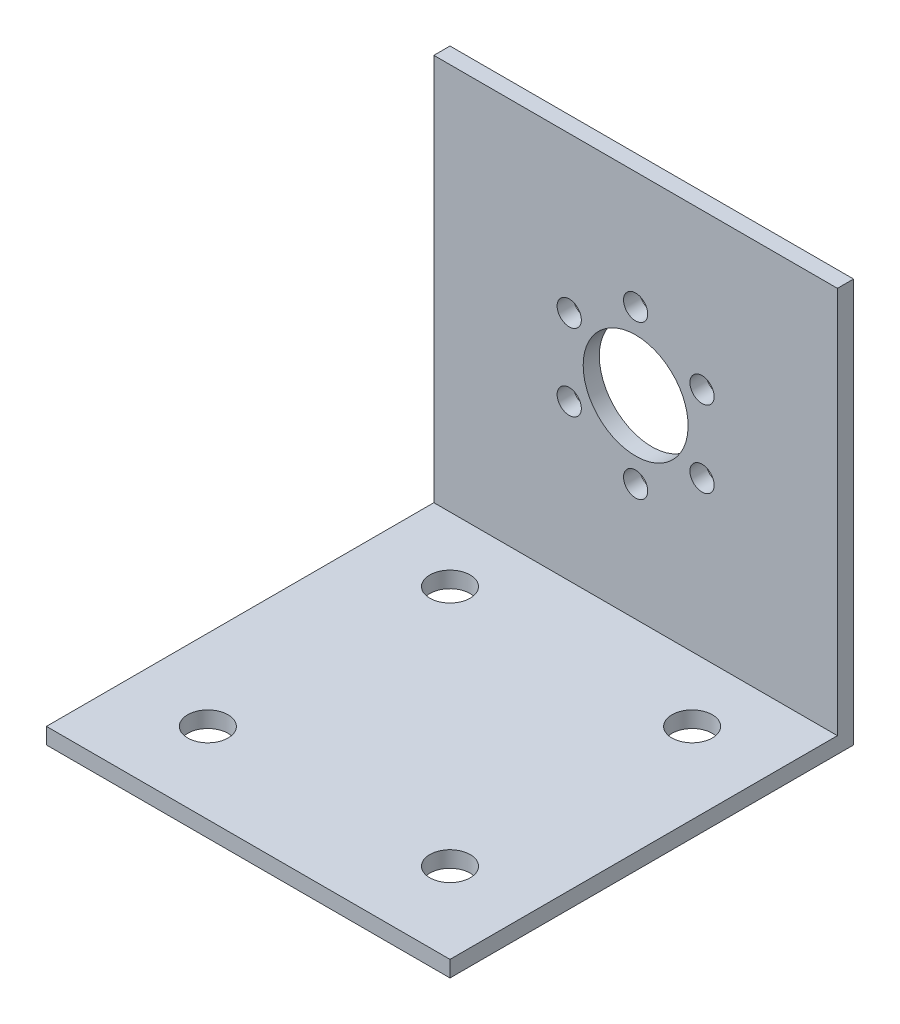
ISO-10303-21;
HEADER;
FILE_DESCRIPTION(('STEP AP214'),'2;1');
FILE_NAME('part.step','',(''),(''),'','','');
FILE_SCHEMA(('AUTOMOTIVE_DESIGN { 1 0 10303 214 1 1 1 1 }'));
ENDSEC;
DATA;
#1=APPLICATION_CONTEXT('core data for automotive mechanical design processes');
#2=APPLICATION_PROTOCOL_DEFINITION('international standard','automotive_design',2000,#1);
#3=PRODUCT_CONTEXT('',#1,'mechanical');
#4=PRODUCT('Part','Part','',(#3));
#5=PRODUCT_RELATED_PRODUCT_CATEGORY('part','',(#4));
#6=PRODUCT_DEFINITION_FORMATION('','',#4);
#7=PRODUCT_DEFINITION_CONTEXT('part definition',#1,'design');
#8=PRODUCT_DEFINITION('design','',#6,#7);
#9=PRODUCT_DEFINITION_SHAPE('','',#8);
#10=(LENGTH_UNIT() NAMED_UNIT(*) SI_UNIT(.MILLI.,.METRE.));
#11=(NAMED_UNIT(*) PLANE_ANGLE_UNIT() SI_UNIT($,.RADIAN.));
#12=(NAMED_UNIT(*) SI_UNIT($,.STERADIAN.) SOLID_ANGLE_UNIT());
#13=UNCERTAINTY_MEASURE_WITH_UNIT(LENGTH_MEASURE(1.E-05),#10,'distance_accuracy_value','');
#14=(GEOMETRIC_REPRESENTATION_CONTEXT(3) GLOBAL_UNCERTAINTY_ASSIGNED_CONTEXT((#13)) GLOBAL_UNIT_ASSIGNED_CONTEXT((#10,
#11,#12)) REPRESENTATION_CONTEXT('',''));
#15=CARTESIAN_POINT('',(0.,0.,0.));
#16=DIRECTION('',(0.,0.,1.));
#17=DIRECTION('',(1.,0.,0.));
#18=AXIS2_PLACEMENT_3D('',#15,#16,#17);
#19=CARTESIAN_POINT('',(50.,2.,0.));
#20=DIRECTION('',(0.,0.,-1.));
#21=DIRECTION('',(0.,1.,0.));
#22=AXIS2_PLACEMENT_3D('',#19,#20,#21);
#23=PLANE('',#22);
#24=DIRECTION('',(0.,-1.,0.));
#25=VECTOR('',#24,1.);
#26=CARTESIAN_POINT('',(0.,2.,0.));
#27=LINE('',#26,#25);
#28=CARTESIAN_POINT('',(0.,2.,0.));
#29=VERTEX_POINT('',#28);
#30=CARTESIAN_POINT('',(0.,0.,0.));
#31=VERTEX_POINT('',#30);
#32=EDGE_CURVE('E121',#29,#31,#27,.T.);
#33=ORIENTED_EDGE('',*,*,#32,.T.);
#34=DIRECTION('',(-1.,0.,0.));
#35=VECTOR('',#34,1.);
#36=CARTESIAN_POINT('',(50.,0.,0.));
#37=LINE('',#36,#35);
#38=CARTESIAN_POINT('',(50.,0.,0.));
#39=VERTEX_POINT('',#38);
#40=EDGE_CURVE('E11',#39,#31,#37,.T.);
#41=ORIENTED_EDGE('',*,*,#40,.F.);
#42=DIRECTION('',(0.,-1.,0.));
#43=VECTOR('',#42,1.);
#44=CARTESIAN_POINT('',(50.,2.,0.));
#45=LINE('',#44,#43);
#46=CARTESIAN_POINT('',(50.,2.,0.));
#47=VERTEX_POINT('',#46);
#48=EDGE_CURVE('E132',#47,#39,#45,.T.);
#49=ORIENTED_EDGE('',*,*,#48,.F.);
#50=DIRECTION('',(-1.,0.,0.));
#51=VECTOR('',#50,1.);
#52=CARTESIAN_POINT('',(50.,2.,0.));
#53=LINE('',#52,#51);
#54=EDGE_CURVE('E117',#47,#29,#53,.T.);
#55=ORIENTED_EDGE('',*,*,#54,.T.);
#56=EDGE_LOOP('',(#33,#41,#49,#55));
#57=FACE_BOUND('',#56,.T.);
#58=ADVANCED_FACE('F35',(#57),#23,.F.);
#59=CARTESIAN_POINT('',(50.,0.,0.));
#60=DIRECTION('',(0.,1.,0.));
#61=DIRECTION('',(0.,0.,1.));
#62=AXIS2_PLACEMENT_3D('',#59,#60,#61);
#63=PLANE('',#62);
#64=CARTESIAN_POINT('',(40.,0.,-10.));
#65=DIRECTION('',(0.,-1.,0.));
#66=DIRECTION('',(0.,0.,-1.));
#67=AXIS2_PLACEMENT_3D('',#64,#65,#66);
#68=CIRCLE('',#67,2.5);
#69=CARTESIAN_POINT('',(40.,0.,-12.5));
#70=VERTEX_POINT('',#69);
#71=EDGE_CURVE('E369',#70,#70,#68,.T.);
#72=ORIENTED_EDGE('',*,*,#71,.F.);
#73=EDGE_LOOP('',(#72));
#74=FACE_BOUND('',#73,.T.);
#75=CARTESIAN_POINT('',(10.,0.,-40.));
#76=DIRECTION('',(0.,-1.,0.));
#77=DIRECTION('',(0.,0.,-1.));
#78=AXIS2_PLACEMENT_3D('',#75,#76,#77);
#79=CIRCLE('',#78,2.5);
#80=CARTESIAN_POINT('',(10.,0.,-42.5));
#81=VERTEX_POINT('',#80);
#82=EDGE_CURVE('E370',#81,#81,#79,.T.);
#83=ORIENTED_EDGE('',*,*,#82,.F.);
#84=EDGE_LOOP('',(#83));
#85=FACE_BOUND('',#84,.T.);
#86=CARTESIAN_POINT('',(40.,0.,-40.));
#87=DIRECTION('',(0.,-1.,0.));
#88=DIRECTION('',(0.,0.,-1.));
#89=AXIS2_PLACEMENT_3D('',#86,#87,#88);
#90=CIRCLE('',#89,2.5);
#91=CARTESIAN_POINT('',(40.,0.,-42.5));
#92=VERTEX_POINT('',#91);
#93=EDGE_CURVE('E375',#92,#92,#90,.T.);
#94=ORIENTED_EDGE('',*,*,#93,.F.);
#95=EDGE_LOOP('',(#94));
#96=FACE_BOUND('',#95,.T.);
#97=CARTESIAN_POINT('',(10.,0.,-10.));
#98=DIRECTION('',(0.,-1.,0.));
#99=DIRECTION('',(0.,0.,-1.));
#100=AXIS2_PLACEMENT_3D('',#97,#98,#99);
#101=CIRCLE('',#100,2.5);
#102=CARTESIAN_POINT('',(10.,0.,-12.5));
#103=VERTEX_POINT('',#102);
#104=EDGE_CURVE('E163',#103,#103,#101,.T.);
#105=ORIENTED_EDGE('',*,*,#104,.F.);
#106=EDGE_LOOP('',(#105));
#107=FACE_BOUND('',#106,.T.);
#108=DIRECTION('',(0.,0.,-1.));
#109=VECTOR('',#108,1.);
#110=CARTESIAN_POINT('',(0.,0.,0.));
#111=LINE('',#110,#109);
#112=CARTESIAN_POINT('',(0.,0.,-50.));
#113=VERTEX_POINT('',#112);
#114=EDGE_CURVE('E124',#31,#113,#111,.T.);
#115=ORIENTED_EDGE('',*,*,#114,.T.);
#116=DIRECTION('',(-1.,0.,0.));
#117=VECTOR('',#116,1.);
#118=CARTESIAN_POINT('',(50.,0.,-50.));
#119=LINE('',#118,#117);
#120=CARTESIAN_POINT('',(50.,0.,-50.));
#121=VERTEX_POINT('',#120);
#122=EDGE_CURVE('E44',#121,#113,#119,.T.);
#123=ORIENTED_EDGE('',*,*,#122,.F.);
#124=DIRECTION('',(0.,0.,-1.));
#125=VECTOR('',#124,1.);
#126=CARTESIAN_POINT('',(50.,0.,0.));
#127=LINE('',#126,#125);
#128=EDGE_CURVE('E90',#39,#121,#127,.T.);
#129=ORIENTED_EDGE('',*,*,#128,.F.);
#130=ORIENTED_EDGE('',*,*,#40,.T.);
#131=EDGE_LOOP('',(#115,#123,#129,#130));
#132=FACE_BOUND('',#131,.T.);
#133=ADVANCED_FACE('F189',(#74,#85,#96,#107,#132),#63,.F.);
#134=CARTESIAN_POINT('',(50.,0.,-50.));
#135=DIRECTION('',(0.,0.,1.));
#136=DIRECTION('',(1.,0.,0.));
#137=AXIS2_PLACEMENT_3D('',#134,#135,#136);
#138=PLANE('',#137);
#139=CARTESIAN_POINT('',(33.227241335952,30.7499999999996,-50.));
#140=DIRECTION('',(0.,0.,-1.));
#141=DIRECTION('',(-1.,0.,0.));
#142=AXIS2_PLACEMENT_3D('',#139,#140,#141);
#143=CIRCLE('',#142,1.50000000000014);
#144=CARTESIAN_POINT('',(31.7272413359518,30.7499999999996,-50.));
#145=VERTEX_POINT('',#144);
#146=EDGE_CURVE('E170',#145,#145,#143,.T.);
#147=ORIENTED_EDGE('',*,*,#146,.F.);
#148=EDGE_LOOP('',(#147));
#149=FACE_BOUND('',#148,.T.);
#150=CARTESIAN_POINT('',(33.2272413359516,21.2499999999997,-50.));
#151=DIRECTION('',(0.,0.,-1.));
#152=DIRECTION('',(-1.,0.,0.));
#153=AXIS2_PLACEMENT_3D('',#150,#151,#152);
#154=CIRCLE('',#153,1.5);
#155=CARTESIAN_POINT('',(31.7272413359516,21.2499999999997,-50.));
#156=VERTEX_POINT('',#155);
#157=EDGE_CURVE('E174',#156,#156,#154,.T.);
#158=ORIENTED_EDGE('',*,*,#157,.F.);
#159=EDGE_LOOP('',(#158));
#160=FACE_BOUND('',#159,.T.);
#161=CARTESIAN_POINT('',(24.9999999999993,16.5,-50.));
#162=DIRECTION('',(0.,0.,-1.));
#163=DIRECTION('',(-1.,0.,0.));
#164=AXIS2_PLACEMENT_3D('',#161,#162,#163);
#165=CIRCLE('',#164,1.5);
#166=CARTESIAN_POINT('',(23.4999999999993,16.5,-50.));
#167=VERTEX_POINT('',#166);
#168=EDGE_CURVE('E179',#167,#167,#165,.T.);
#169=ORIENTED_EDGE('',*,*,#168,.F.);
#170=EDGE_LOOP('',(#169));
#171=FACE_BOUND('',#170,.T.);
#172=CARTESIAN_POINT('',(16.7727586640473,21.2500000000003,-50.));
#173=DIRECTION('',(0.,0.,-1.));
#174=DIRECTION('',(-1.,0.,0.));
#175=AXIS2_PLACEMENT_3D('',#172,#173,#174);
#176=CIRCLE('',#175,1.5);
#177=CARTESIAN_POINT('',(15.2727586640473,21.2500000000003,-50.));
#178=VERTEX_POINT('',#177);
#179=EDGE_CURVE('E384',#178,#178,#176,.T.);
#180=ORIENTED_EDGE('',*,*,#179,.F.);
#181=EDGE_LOOP('',(#180));
#182=FACE_BOUND('',#181,.T.);
#183=CARTESIAN_POINT('',(16.7727586640476,30.7500000000003,-50.));
#184=DIRECTION('',(0.,0.,-1.));
#185=DIRECTION('',(-1.,0.,0.));
#186=AXIS2_PLACEMENT_3D('',#183,#184,#185);
#187=CIRCLE('',#186,1.5);
#188=CARTESIAN_POINT('',(15.2727586640476,30.7500000000003,-50.));
#189=VERTEX_POINT('',#188);
#190=EDGE_CURVE('E381',#189,#189,#187,.T.);
#191=ORIENTED_EDGE('',*,*,#190,.F.);
#192=EDGE_LOOP('',(#191));
#193=FACE_BOUND('',#192,.T.);
#194=CARTESIAN_POINT('',(25.,35.5,-50.));
#195=DIRECTION('',(0.,0.,-1.));
#196=DIRECTION('',(-1.,0.,0.));
#197=AXIS2_PLACEMENT_3D('',#194,#195,#196);
#198=CIRCLE('',#197,1.5);
#199=CARTESIAN_POINT('',(23.5,35.5,-50.));
#200=VERTEX_POINT('',#199);
#201=EDGE_CURVE('E185',#200,#200,#198,.T.);
#202=ORIENTED_EDGE('',*,*,#201,.F.);
#203=EDGE_LOOP('',(#202));
#204=FACE_BOUND('',#203,.T.);
#205=CARTESIAN_POINT('',(25.,26.,-50.));
#206=DIRECTION('',(0.,0.,-1.));
#207=DIRECTION('',(-1.,0.,0.));
#208=AXIS2_PLACEMENT_3D('',#205,#206,#207);
#209=CIRCLE('',#208,6.5);
#210=CARTESIAN_POINT('',(18.5,26.,-50.));
#211=VERTEX_POINT('',#210);
#212=EDGE_CURVE('E142',#211,#211,#209,.T.);
#213=ORIENTED_EDGE('',*,*,#212,.F.);
#214=EDGE_LOOP('',(#213));
#215=FACE_BOUND('',#214,.T.);
#216=DIRECTION('',(0.,1.,0.));
#217=VECTOR('',#216,1.);
#218=CARTESIAN_POINT('',(0.,0.,-50.));
#219=LINE('',#218,#217);
#220=CARTESIAN_POINT('',(0.,50.,-50.));
#221=VERTEX_POINT('',#220);
#222=EDGE_CURVE('E127',#113,#221,#219,.T.);
#223=ORIENTED_EDGE('',*,*,#222,.T.);
#224=DIRECTION('',(-1.,0.,0.));
#225=VECTOR('',#224,1.);
#226=CARTESIAN_POINT('',(50.,50.,-50.));
#227=LINE('',#226,#225);
#228=CARTESIAN_POINT('',(50.,50.,-50.));
#229=VERTEX_POINT('',#228);
#230=EDGE_CURVE('E112',#229,#221,#227,.T.);
#231=ORIENTED_EDGE('',*,*,#230,.F.);
#232=DIRECTION('',(0.,1.,0.));
#233=VECTOR('',#232,1.);
#234=CARTESIAN_POINT('',(50.,0.,-50.));
#235=LINE('',#234,#233);
#236=EDGE_CURVE('E103',#121,#229,#235,.T.);
#237=ORIENTED_EDGE('',*,*,#236,.F.);
#238=ORIENTED_EDGE('',*,*,#122,.T.);
#239=EDGE_LOOP('',(#223,#231,#237,#238));
#240=FACE_BOUND('',#239,.T.);
#241=ADVANCED_FACE('F192',(#149,#160,#171,#182,#193,#204,#215,#240),#138,.F.);
#242=CARTESIAN_POINT('',(50.,50.,-50.));
#243=DIRECTION('',(0.,-1.,0.));
#244=DIRECTION('',(0.,0.,-1.));
#245=AXIS2_PLACEMENT_3D('',#242,#243,#244);
#246=PLANE('',#245);
#247=DIRECTION('',(0.,0.,1.));
#248=VECTOR('',#247,1.);
#249=CARTESIAN_POINT('',(0.,50.,-50.));
#250=LINE('',#249,#248);
#251=CARTESIAN_POINT('',(0.,50.,-48.));
#252=VERTEX_POINT('',#251);
#253=EDGE_CURVE('E111',#221,#252,#250,.T.);
#254=ORIENTED_EDGE('',*,*,#253,.T.);
#255=DIRECTION('',(-1.,0.,0.));
#256=VECTOR('',#255,1.);
#257=CARTESIAN_POINT('',(50.,50.,-48.));
#258=LINE('',#257,#256);
#259=CARTESIAN_POINT('',(50.,50.,-48.));
#260=VERTEX_POINT('',#259);
#261=EDGE_CURVE('E108',#260,#252,#258,.T.);
#262=ORIENTED_EDGE('',*,*,#261,.F.);
#263=DIRECTION('',(0.,0.,1.));
#264=VECTOR('',#263,1.);
#265=CARTESIAN_POINT('',(50.,50.,-50.));
#266=LINE('',#265,#264);
#267=EDGE_CURVE('E97',#229,#260,#266,.T.);
#268=ORIENTED_EDGE('',*,*,#267,.F.);
#269=ORIENTED_EDGE('',*,*,#230,.T.);
#270=EDGE_LOOP('',(#254,#262,#268,#269));
#271=FACE_BOUND('',#270,.T.);
#272=ADVANCED_FACE('F109',(#271),#246,.F.);
#273=CARTESIAN_POINT('',(50.,50.,-48.));
#274=DIRECTION('',(0.,0.,-1.));
#275=DIRECTION('',(0.,1.,0.));
#276=AXIS2_PLACEMENT_3D('',#273,#274,#275);
#277=PLANE('',#276);
#278=CARTESIAN_POINT('',(33.227241335952,30.7499999999996,-48.));
#279=DIRECTION('',(0.,0.,-1.));
#280=DIRECTION('',(0.,1.,0.));
#281=AXIS2_PLACEMENT_3D('',#278,#279,#280);
#282=CIRCLE('',#281,1.50000000000014);
#283=CARTESIAN_POINT('',(33.227241335952,32.2499999999998,-48.));
#284=VERTEX_POINT('',#283);
#285=EDGE_CURVE('E125',#284,#284,#282,.T.);
#286=ORIENTED_EDGE('',*,*,#285,.T.);
#287=EDGE_LOOP('',(#286));
#288=FACE_BOUND('',#287,.T.);
#289=CARTESIAN_POINT('',(33.2272413359516,21.2499999999997,-48.));
#290=DIRECTION('',(0.,0.,-1.));
#291=DIRECTION('',(0.,1.,0.));
#292=AXIS2_PLACEMENT_3D('',#289,#290,#291);
#293=CIRCLE('',#292,1.5);
#294=CARTESIAN_POINT('',(33.2272413359516,22.7499999999997,-48.));
#295=VERTEX_POINT('',#294);
#296=EDGE_CURVE('E154',#295,#295,#293,.T.);
#297=ORIENTED_EDGE('',*,*,#296,.T.);
#298=EDGE_LOOP('',(#297));
#299=FACE_BOUND('',#298,.T.);
#300=CARTESIAN_POINT('',(24.9999999999993,16.5,-48.));
#301=DIRECTION('',(0.,0.,-1.));
#302=DIRECTION('',(0.,1.,0.));
#303=AXIS2_PLACEMENT_3D('',#300,#301,#302);
#304=CIRCLE('',#303,1.5);
#305=CARTESIAN_POINT('',(24.9999999999993,18.,-48.));
#306=VERTEX_POINT('',#305);
#307=EDGE_CURVE('E151',#306,#306,#304,.T.);
#308=ORIENTED_EDGE('',*,*,#307,.T.);
#309=EDGE_LOOP('',(#308));
#310=FACE_BOUND('',#309,.T.);
#311=CARTESIAN_POINT('',(16.7727586640473,21.2500000000003,-48.));
#312=DIRECTION('',(0.,0.,-1.));
#313=DIRECTION('',(0.,1.,0.));
#314=AXIS2_PLACEMENT_3D('',#311,#312,#313);
#315=CIRCLE('',#314,1.5);
#316=CARTESIAN_POINT('',(16.7727586640473,22.7500000000003,-48.));
#317=VERTEX_POINT('',#316);
#318=EDGE_CURVE('E148',#317,#317,#315,.T.);
#319=ORIENTED_EDGE('',*,*,#318,.T.);
#320=EDGE_LOOP('',(#319));
#321=FACE_BOUND('',#320,.T.);
#322=CARTESIAN_POINT('',(16.7727586640476,30.7500000000003,-48.));
#323=DIRECTION('',(0.,0.,-1.));
#324=DIRECTION('',(0.,1.,0.));
#325=AXIS2_PLACEMENT_3D('',#322,#323,#324);
#326=CIRCLE('',#325,1.5);
#327=CARTESIAN_POINT('',(16.7727586640476,32.2500000000003,-48.));
#328=VERTEX_POINT('',#327);
#329=EDGE_CURVE('E145',#328,#328,#326,.T.);
#330=ORIENTED_EDGE('',*,*,#329,.T.);
#331=EDGE_LOOP('',(#330));
#332=FACE_BOUND('',#331,.T.);
#333=CARTESIAN_POINT('',(25.,35.5,-48.));
#334=DIRECTION('',(0.,0.,-1.));
#335=DIRECTION('',(0.,1.,0.));
#336=AXIS2_PLACEMENT_3D('',#333,#334,#335);
#337=CIRCLE('',#336,1.5);
#338=CARTESIAN_POINT('',(25.,37.,-48.));
#339=VERTEX_POINT('',#338);
#340=EDGE_CURVE('E141',#339,#339,#337,.T.);
#341=ORIENTED_EDGE('',*,*,#340,.T.);
#342=EDGE_LOOP('',(#341));
#343=FACE_BOUND('',#342,.T.);
#344=CARTESIAN_POINT('',(25.,26.,-48.));
#345=DIRECTION('',(0.,0.,-1.));
#346=DIRECTION('',(0.,1.,0.));
#347=AXIS2_PLACEMENT_3D('',#344,#345,#346);
#348=CIRCLE('',#347,6.5);
#349=CARTESIAN_POINT('',(25.,32.5,-48.));
#350=VERTEX_POINT('',#349);
#351=EDGE_CURVE('E138',#350,#350,#348,.T.);
#352=ORIENTED_EDGE('',*,*,#351,.T.);
#353=EDGE_LOOP('',(#352));
#354=FACE_BOUND('',#353,.T.);
#355=DIRECTION('',(0.,-1.,0.));
#356=VECTOR('',#355,1.);
#357=CARTESIAN_POINT('',(0.,50.,-48.));
#358=LINE('',#357,#356);
#359=CARTESIAN_POINT('',(0.,2.00000000000001,-48.));
#360=VERTEX_POINT('',#359);
#361=EDGE_CURVE('E76',#252,#360,#358,.T.);
#362=ORIENTED_EDGE('',*,*,#361,.T.);
#363=DIRECTION('',(-1.,0.,0.));
#364=VECTOR('',#363,1.);
#365=CARTESIAN_POINT('',(50.,2.00000000000001,-48.));
#366=LINE('',#365,#364);
#367=CARTESIAN_POINT('',(50.,2.00000000000001,-48.));
#368=VERTEX_POINT('',#367);
#369=EDGE_CURVE('E113',#368,#360,#366,.T.);
#370=ORIENTED_EDGE('',*,*,#369,.F.);
#371=DIRECTION('',(0.,-1.,0.));
#372=VECTOR('',#371,1.);
#373=CARTESIAN_POINT('',(50.,50.,-48.));
#374=LINE('',#373,#372);
#375=EDGE_CURVE('E101',#260,#368,#374,.T.);
#376=ORIENTED_EDGE('',*,*,#375,.F.);
#377=ORIENTED_EDGE('',*,*,#261,.T.);
#378=EDGE_LOOP('',(#362,#370,#376,#377));
#379=FACE_BOUND('',#378,.T.);
#380=ADVANCED_FACE('F115',(#288,#299,#310,#321,#332,#343,#354,#379),#277,.F.);
#381=CARTESIAN_POINT('',(50.,2.00000000000001,-48.));
#382=DIRECTION('',(0.,-1.,0.));
#383=DIRECTION('',(0.,0.,-1.));
#384=AXIS2_PLACEMENT_3D('',#381,#382,#383);
#385=PLANE('',#384);
#386=CARTESIAN_POINT('',(40.,2.,-10.));
#387=DIRECTION('',(0.,-1.,0.));
#388=DIRECTION('',(0.,0.,-1.));
#389=AXIS2_PLACEMENT_3D('',#386,#387,#388);
#390=CIRCLE('',#389,2.5);
#391=CARTESIAN_POINT('',(40.,2.,-12.5));
#392=VERTEX_POINT('',#391);
#393=EDGE_CURVE('E38',#392,#392,#390,.T.);
#394=ORIENTED_EDGE('',*,*,#393,.T.);
#395=EDGE_LOOP('',(#394));
#396=FACE_BOUND('',#395,.T.);
#397=CARTESIAN_POINT('',(10.,2.00000000000001,-40.));
#398=DIRECTION('',(0.,-1.,0.));
#399=DIRECTION('',(0.,0.,-1.));
#400=AXIS2_PLACEMENT_3D('',#397,#398,#399);
#401=CIRCLE('',#400,2.5);
#402=CARTESIAN_POINT('',(10.,2.00000000000001,-42.5));
#403=VERTEX_POINT('',#402);
#404=EDGE_CURVE('E165',#403,#403,#401,.T.);
#405=ORIENTED_EDGE('',*,*,#404,.T.);
#406=EDGE_LOOP('',(#405));
#407=FACE_BOUND('',#406,.T.);
#408=CARTESIAN_POINT('',(40.,2.00000000000001,-40.));
#409=DIRECTION('',(0.,-1.,0.));
#410=DIRECTION('',(0.,0.,-1.));
#411=AXIS2_PLACEMENT_3D('',#408,#409,#410);
#412=CIRCLE('',#411,2.5);
#413=CARTESIAN_POINT('',(40.,2.00000000000001,-42.5));
#414=VERTEX_POINT('',#413);
#415=EDGE_CURVE('E162',#414,#414,#412,.T.);
#416=ORIENTED_EDGE('',*,*,#415,.T.);
#417=EDGE_LOOP('',(#416));
#418=FACE_BOUND('',#417,.T.);
#419=CARTESIAN_POINT('',(10.,2.,-10.));
#420=DIRECTION('',(0.,-1.,0.));
#421=DIRECTION('',(0.,0.,-1.));
#422=AXIS2_PLACEMENT_3D('',#419,#420,#421);
#423=CIRCLE('',#422,2.5);
#424=CARTESIAN_POINT('',(10.,2.,-12.5));
#425=VERTEX_POINT('',#424);
#426=EDGE_CURVE('E159',#425,#425,#423,.T.);
#427=ORIENTED_EDGE('',*,*,#426,.T.);
#428=EDGE_LOOP('',(#427));
#429=FACE_BOUND('',#428,.T.);
#430=DIRECTION('',(0.,0.,1.));
#431=VECTOR('',#430,1.);
#432=CARTESIAN_POINT('',(0.,2.00000000000001,-48.));
#433=LINE('',#432,#431);
#434=EDGE_CURVE('E82',#360,#29,#433,.T.);
#435=ORIENTED_EDGE('',*,*,#434,.T.);
#436=ORIENTED_EDGE('',*,*,#54,.F.);
#437=DIRECTION('',(0.,0.,1.));
#438=VECTOR('',#437,1.);
#439=CARTESIAN_POINT('',(50.,2.00000000000001,-48.));
#440=LINE('',#439,#438);
#441=EDGE_CURVE('E53',#368,#47,#440,.T.);
#442=ORIENTED_EDGE('',*,*,#441,.F.);
#443=ORIENTED_EDGE('',*,*,#369,.T.);
#444=EDGE_LOOP('',(#435,#436,#442,#443));
#445=FACE_BOUND('',#444,.T.);
#446=ADVANCED_FACE('F197',(#396,#407,#418,#429,#445),#385,.F.);
#447=CARTESIAN_POINT('',(50.,0.,0.));
#448=DIRECTION('',(1.,0.,0.));
#449=DIRECTION('',(0.,0.,-1.));
#450=AXIS2_PLACEMENT_3D('',#447,#448,#449);
#451=PLANE('',#450);
#452=ORIENTED_EDGE('',*,*,#48,.T.);
#453=ORIENTED_EDGE('',*,*,#128,.T.);
#454=ORIENTED_EDGE('',*,*,#236,.T.);
#455=ORIENTED_EDGE('',*,*,#267,.T.);
#456=ORIENTED_EDGE('',*,*,#375,.T.);
#457=ORIENTED_EDGE('',*,*,#441,.T.);
#458=EDGE_LOOP('',(#452,#453,#454,#455,#456,#457));
#459=FACE_BOUND('',#458,.T.);
#460=ADVANCED_FACE('F99',(#459),#451,.T.);
#461=CARTESIAN_POINT('',(0.,0.,0.));
#462=DIRECTION('',(1.,0.,0.));
#463=DIRECTION('',(0.,0.,-1.));
#464=AXIS2_PLACEMENT_3D('',#461,#462,#463);
#465=PLANE('',#464);
#466=ORIENTED_EDGE('',*,*,#32,.F.);
#467=ORIENTED_EDGE('',*,*,#434,.F.);
#468=ORIENTED_EDGE('',*,*,#361,.F.);
#469=ORIENTED_EDGE('',*,*,#253,.F.);
#470=ORIENTED_EDGE('',*,*,#222,.F.);
#471=ORIENTED_EDGE('',*,*,#114,.F.);
#472=EDGE_LOOP('',(#466,#467,#468,#469,#470,#471));
#473=FACE_BOUND('',#472,.T.);
#474=ADVANCED_FACE('F195',(#473),#465,.F.);
#475=CARTESIAN_POINT('',(25.,26.,0.));
#476=DIRECTION('',(0.,0.,-1.));
#477=DIRECTION('',(-1.,0.,0.));
#478=AXIS2_PLACEMENT_3D('',#475,#476,#477);
#479=CYLINDRICAL_SURFACE('',#478,6.5);
#480=ORIENTED_EDGE('',*,*,#212,.T.);
#481=EDGE_LOOP('',(#480));
#482=FACE_BOUND('',#481,.T.);
#483=ORIENTED_EDGE('',*,*,#351,.F.);
#484=EDGE_LOOP('',(#483));
#485=FACE_BOUND('',#484,.T.);
#486=ADVANCED_FACE('F240',(#482,#485),#479,.F.);
#487=CARTESIAN_POINT('',(25.,35.5,0.));
#488=DIRECTION('',(0.,0.,-1.));
#489=DIRECTION('',(-1.,0.,0.));
#490=AXIS2_PLACEMENT_3D('',#487,#488,#489);
#491=CYLINDRICAL_SURFACE('',#490,1.5);
#492=ORIENTED_EDGE('',*,*,#201,.T.);
#493=EDGE_LOOP('',(#492));
#494=FACE_BOUND('',#493,.T.);
#495=ORIENTED_EDGE('',*,*,#340,.F.);
#496=EDGE_LOOP('',(#495));
#497=FACE_BOUND('',#496,.T.);
#498=ADVANCED_FACE('F245',(#494,#497),#491,.F.);
#499=CARTESIAN_POINT('',(16.7727586640476,30.7500000000003,0.));
#500=DIRECTION('',(0.,0.,-1.));
#501=DIRECTION('',(-1.,0.,0.));
#502=AXIS2_PLACEMENT_3D('',#499,#500,#501);
#503=CYLINDRICAL_SURFACE('',#502,1.5);
#504=ORIENTED_EDGE('',*,*,#190,.T.);
#505=EDGE_LOOP('',(#504));
#506=FACE_BOUND('',#505,.T.);
#507=ORIENTED_EDGE('',*,*,#329,.F.);
#508=EDGE_LOOP('',(#507));
#509=FACE_BOUND('',#508,.T.);
#510=ADVANCED_FACE('F257',(#506,#509),#503,.F.);
#511=CARTESIAN_POINT('',(16.7727586640473,21.2500000000003,0.));
#512=DIRECTION('',(0.,0.,-1.));
#513=DIRECTION('',(-1.,0.,0.));
#514=AXIS2_PLACEMENT_3D('',#511,#512,#513);
#515=CYLINDRICAL_SURFACE('',#514,1.5);
#516=ORIENTED_EDGE('',*,*,#179,.T.);
#517=EDGE_LOOP('',(#516));
#518=FACE_BOUND('',#517,.T.);
#519=ORIENTED_EDGE('',*,*,#318,.F.);
#520=EDGE_LOOP('',(#519));
#521=FACE_BOUND('',#520,.T.);
#522=ADVANCED_FACE('F267',(#518,#521),#515,.F.);
#523=CARTESIAN_POINT('',(24.9999999999993,16.5,0.));
#524=DIRECTION('',(0.,0.,-1.));
#525=DIRECTION('',(-1.,0.,0.));
#526=AXIS2_PLACEMENT_3D('',#523,#524,#525);
#527=CYLINDRICAL_SURFACE('',#526,1.5);
#528=ORIENTED_EDGE('',*,*,#168,.T.);
#529=EDGE_LOOP('',(#528));
#530=FACE_BOUND('',#529,.T.);
#531=ORIENTED_EDGE('',*,*,#307,.F.);
#532=EDGE_LOOP('',(#531));
#533=FACE_BOUND('',#532,.T.);
#534=ADVANCED_FACE('F277',(#530,#533),#527,.F.);
#535=CARTESIAN_POINT('',(33.2272413359516,21.2499999999997,0.));
#536=DIRECTION('',(0.,0.,-1.));
#537=DIRECTION('',(-1.,0.,0.));
#538=AXIS2_PLACEMENT_3D('',#535,#536,#537);
#539=CYLINDRICAL_SURFACE('',#538,1.5);
#540=ORIENTED_EDGE('',*,*,#157,.T.);
#541=EDGE_LOOP('',(#540));
#542=FACE_BOUND('',#541,.T.);
#543=ORIENTED_EDGE('',*,*,#296,.F.);
#544=EDGE_LOOP('',(#543));
#545=FACE_BOUND('',#544,.T.);
#546=ADVANCED_FACE('F287',(#542,#545),#539,.F.);
#547=CARTESIAN_POINT('',(33.227241335952,30.7499999999996,0.));
#548=DIRECTION('',(0.,0.,-1.));
#549=DIRECTION('',(-1.,0.,0.));
#550=AXIS2_PLACEMENT_3D('',#547,#548,#549);
#551=CYLINDRICAL_SURFACE('',#550,1.50000000000014);
#552=ORIENTED_EDGE('',*,*,#146,.T.);
#553=EDGE_LOOP('',(#552));
#554=FACE_BOUND('',#553,.T.);
#555=ORIENTED_EDGE('',*,*,#285,.F.);
#556=EDGE_LOOP('',(#555));
#557=FACE_BOUND('',#556,.T.);
#558=ADVANCED_FACE('F297',(#554,#557),#551,.F.);
#559=CARTESIAN_POINT('',(10.,50.,-10.));
#560=DIRECTION('',(0.,-1.,0.));
#561=DIRECTION('',(0.,0.,-1.));
#562=AXIS2_PLACEMENT_3D('',#559,#560,#561);
#563=CYLINDRICAL_SURFACE('',#562,2.5);
#564=ORIENTED_EDGE('',*,*,#104,.T.);
#565=EDGE_LOOP('',(#564));
#566=FACE_BOUND('',#565,.T.);
#567=ORIENTED_EDGE('',*,*,#426,.F.);
#568=EDGE_LOOP('',(#567));
#569=FACE_BOUND('',#568,.T.);
#570=ADVANCED_FACE('F306',(#566,#569),#563,.F.);
#571=CARTESIAN_POINT('',(40.,50.,-40.));
#572=DIRECTION('',(0.,-1.,0.));
#573=DIRECTION('',(0.,0.,-1.));
#574=AXIS2_PLACEMENT_3D('',#571,#572,#573);
#575=CYLINDRICAL_SURFACE('',#574,2.5);
#576=ORIENTED_EDGE('',*,*,#93,.T.);
#577=EDGE_LOOP('',(#576));
#578=FACE_BOUND('',#577,.T.);
#579=ORIENTED_EDGE('',*,*,#415,.F.);
#580=EDGE_LOOP('',(#579));
#581=FACE_BOUND('',#580,.T.);
#582=ADVANCED_FACE('F325',(#578,#581),#575,.F.);
#583=CARTESIAN_POINT('',(10.,50.,-40.));
#584=DIRECTION('',(0.,-1.,0.));
#585=DIRECTION('',(0.,0.,-1.));
#586=AXIS2_PLACEMENT_3D('',#583,#584,#585);
#587=CYLINDRICAL_SURFACE('',#586,2.5);
#588=ORIENTED_EDGE('',*,*,#82,.T.);
#589=EDGE_LOOP('',(#588));
#590=FACE_BOUND('',#589,.T.);
#591=ORIENTED_EDGE('',*,*,#404,.F.);
#592=EDGE_LOOP('',(#591));
#593=FACE_BOUND('',#592,.T.);
#594=ADVANCED_FACE('F335',(#590,#593),#587,.F.);
#595=CARTESIAN_POINT('',(40.,50.,-10.));
#596=DIRECTION('',(0.,-1.,0.));
#597=DIRECTION('',(0.,0.,-1.));
#598=AXIS2_PLACEMENT_3D('',#595,#596,#597);
#599=CYLINDRICAL_SURFACE('',#598,2.5);
#600=ORIENTED_EDGE('',*,*,#71,.T.);
#601=EDGE_LOOP('',(#600));
#602=FACE_BOUND('',#601,.T.);
#603=ORIENTED_EDGE('',*,*,#393,.F.);
#604=EDGE_LOOP('',(#603));
#605=FACE_BOUND('',#604,.T.);
#606=ADVANCED_FACE('F345',(#602,#605),#599,.F.);
#607=CLOSED_SHELL('',(#58,#133,#241,#272,#380,#446,#460,#474,#486,#498,#510,#522,#534,#546,#558,
#570,#582,#594,#606));
#608=MANIFOLD_SOLID_BREP('B2',#607);
#609=ADVANCED_BREP_SHAPE_REPRESENTATION('',(#18,#608),#14);
#610=SHAPE_DEFINITION_REPRESENTATION(#9,#609);
ENDSEC;
END-ISO-10303-21;
